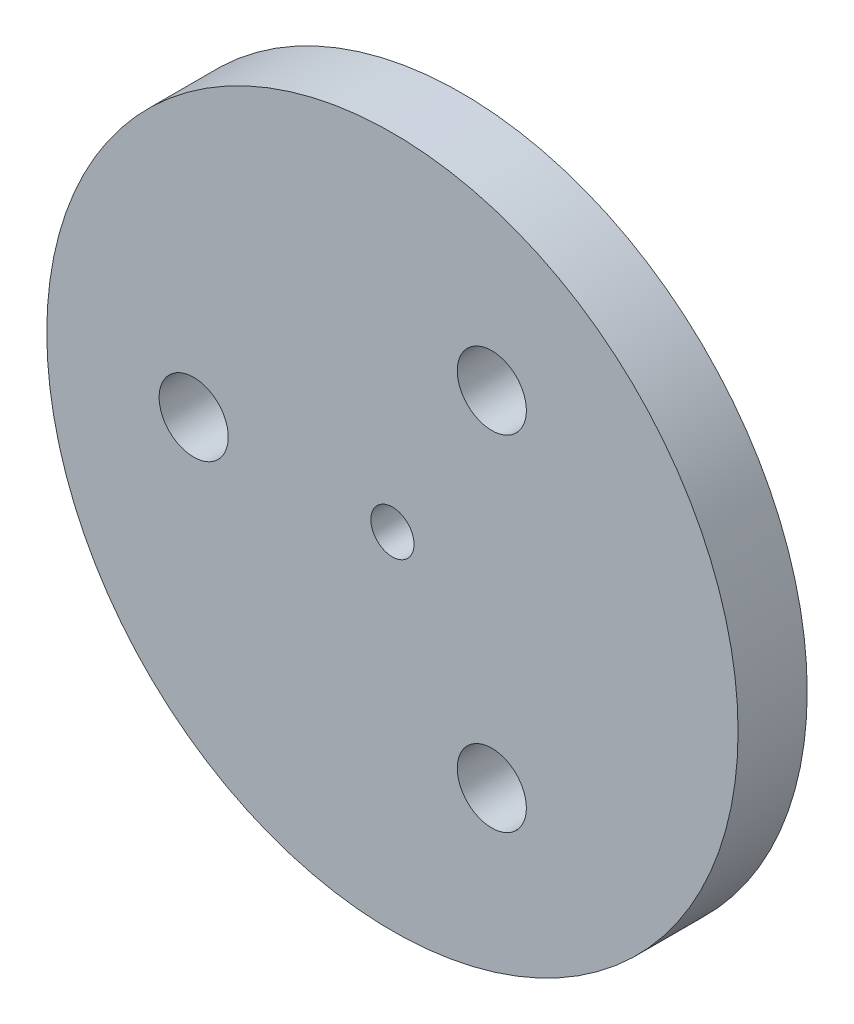
ISO-10303-21;
HEADER;
FILE_DESCRIPTION(('STEP AP214'),'2;1');
FILE_NAME('part.step','',(''),(''),'','','');
FILE_SCHEMA(('AUTOMOTIVE_DESIGN { 1 0 10303 214 1 1 1 1 }'));
ENDSEC;
DATA;
#1=APPLICATION_CONTEXT('core data for automotive mechanical design processes');
#2=APPLICATION_PROTOCOL_DEFINITION('international standard','automotive_design',2000,#1);
#3=PRODUCT_CONTEXT('',#1,'mechanical');
#4=PRODUCT('Part','Part','',(#3));
#5=PRODUCT_RELATED_PRODUCT_CATEGORY('part','',(#4));
#6=PRODUCT_DEFINITION_FORMATION('','',#4);
#7=PRODUCT_DEFINITION_CONTEXT('part definition',#1,'design');
#8=PRODUCT_DEFINITION('design','',#6,#7);
#9=PRODUCT_DEFINITION_SHAPE('','',#8);
#10=(LENGTH_UNIT() NAMED_UNIT(*) SI_UNIT(.MILLI.,.METRE.));
#11=(NAMED_UNIT(*) PLANE_ANGLE_UNIT() SI_UNIT($,.RADIAN.));
#12=(NAMED_UNIT(*) SI_UNIT($,.STERADIAN.) SOLID_ANGLE_UNIT());
#13=UNCERTAINTY_MEASURE_WITH_UNIT(LENGTH_MEASURE(1.E-05),#10,'distance_accuracy_value','');
#14=(GEOMETRIC_REPRESENTATION_CONTEXT(3) GLOBAL_UNCERTAINTY_ASSIGNED_CONTEXT((#13)) GLOBAL_UNIT_ASSIGNED_CONTEXT((#10,
#11,#12)) REPRESENTATION_CONTEXT('',''));
#15=CARTESIAN_POINT('',(0.,0.,0.));
#16=DIRECTION('',(0.,0.,1.));
#17=DIRECTION('',(1.,0.,0.));
#18=AXIS2_PLACEMENT_3D('',#15,#16,#17);
#19=CARTESIAN_POINT('',(0.,0.,4.));
#20=DIRECTION('',(0.,0.,1.));
#21=DIRECTION('',(1.,0.,0.));
#22=AXIS2_PLACEMENT_3D('',#19,#20,#21);
#23=PLANE('',#22);
#24=CARTESIAN_POINT('',(0.,0.,4.));
#25=DIRECTION('',(0.,0.,1.));
#26=DIRECTION('',(1.,0.,0.));
#27=AXIS2_PLACEMENT_3D('',#24,#25,#26);
#28=CIRCLE('',#27,1.25);
#29=CARTESIAN_POINT('',(1.25,0.,4.));
#30=VERTEX_POINT('',#29);
#31=EDGE_CURVE('E79',#30,#30,#28,.T.);
#32=ORIENTED_EDGE('',*,*,#31,.F.);
#33=EDGE_LOOP('',(#32));
#34=FACE_BOUND('',#33,.T.);
#35=CARTESIAN_POINT('',(5.75000000000005,9.95929214352102,4.));
#36=DIRECTION('',(0.,0.,1.));
#37=DIRECTION('',(1.,0.,0.));
#38=AXIS2_PLACEMENT_3D('',#35,#36,#37);
#39=CIRCLE('',#38,2.);
#40=CARTESIAN_POINT('',(7.75000000000005,9.95929214352102,4.));
#41=VERTEX_POINT('',#40);
#42=EDGE_CURVE('E59',#41,#41,#39,.T.);
#43=ORIENTED_EDGE('',*,*,#42,.F.);
#44=EDGE_LOOP('',(#43));
#45=FACE_BOUND('',#44,.T.);
#46=CARTESIAN_POINT('',(0.,0.,4.));
#47=DIRECTION('',(0.,0.,1.));
#48=DIRECTION('',(1.,0.,0.));
#49=AXIS2_PLACEMENT_3D('',#46,#47,#48);
#50=CIRCLE('',#49,20.);
#51=CARTESIAN_POINT('',(20.,0.,4.));
#52=VERTEX_POINT('',#51);
#53=EDGE_CURVE('E10',#52,#52,#50,.T.);
#54=ORIENTED_EDGE('',*,*,#53,.T.);
#55=EDGE_LOOP('',(#54));
#56=FACE_BOUND('',#55,.T.);
#57=CARTESIAN_POINT('',(-11.5,0.,4.));
#58=DIRECTION('',(0.,0.,1.));
#59=DIRECTION('',(1.,0.,0.));
#60=AXIS2_PLACEMENT_3D('',#57,#58,#59);
#61=CIRCLE('',#60,2.);
#62=CARTESIAN_POINT('',(-9.5,0.,4.));
#63=VERTEX_POINT('',#62);
#64=EDGE_CURVE('E53',#63,#63,#61,.T.);
#65=ORIENTED_EDGE('',*,*,#64,.F.);
#66=EDGE_LOOP('',(#65));
#67=FACE_BOUND('',#66,.T.);
#68=CARTESIAN_POINT('',(5.74999999999991,-9.95929214352109,4.));
#69=DIRECTION('',(0.,0.,1.));
#70=DIRECTION('',(1.,0.,0.));
#71=AXIS2_PLACEMENT_3D('',#68,#69,#70);
#72=CIRCLE('',#71,2.);
#73=CARTESIAN_POINT('',(7.7499999999999,-9.95929214352109,4.));
#74=VERTEX_POINT('',#73);
#75=EDGE_CURVE('E67',#74,#74,#72,.T.);
#76=ORIENTED_EDGE('',*,*,#75,.F.);
#77=EDGE_LOOP('',(#76));
#78=FACE_BOUND('',#77,.T.);
#79=ADVANCED_FACE('F40',(#34,#45,#56,#67,#78),#23,.T.);
#80=CARTESIAN_POINT('',(0.,0.,0.));
#81=DIRECTION('',(0.,0.,1.));
#82=DIRECTION('',(1.,0.,0.));
#83=AXIS2_PLACEMENT_3D('',#80,#81,#82);
#84=PLANE('',#83);
#85=CARTESIAN_POINT('',(0.,0.,0.));
#86=DIRECTION('',(0.,0.,1.));
#87=DIRECTION('',(1.,0.,0.));
#88=AXIS2_PLACEMENT_3D('',#85,#86,#87);
#89=CIRCLE('',#88,1.25);
#90=CARTESIAN_POINT('',(1.25,0.,0.));
#91=VERTEX_POINT('',#90);
#92=EDGE_CURVE('E75',#91,#91,#89,.T.);
#93=ORIENTED_EDGE('',*,*,#92,.T.);
#94=EDGE_LOOP('',(#93));
#95=FACE_BOUND('',#94,.T.);
#96=CARTESIAN_POINT('',(0.,0.,0.));
#97=DIRECTION('',(0.,0.,1.));
#98=DIRECTION('',(1.,0.,0.));
#99=AXIS2_PLACEMENT_3D('',#96,#97,#98);
#100=CIRCLE('',#99,20.);
#101=CARTESIAN_POINT('',(20.,0.,0.));
#102=VERTEX_POINT('',#101);
#103=EDGE_CURVE('E44',#102,#102,#100,.T.);
#104=ORIENTED_EDGE('',*,*,#103,.F.);
#105=EDGE_LOOP('',(#104));
#106=FACE_BOUND('',#105,.T.);
#107=CARTESIAN_POINT('',(-11.5,0.,0.));
#108=DIRECTION('',(0.,0.,1.));
#109=DIRECTION('',(1.,0.,0.));
#110=AXIS2_PLACEMENT_3D('',#107,#108,#109);
#111=CIRCLE('',#110,2.);
#112=CARTESIAN_POINT('',(-9.5,0.,0.));
#113=VERTEX_POINT('',#112);
#114=EDGE_CURVE('E55',#113,#113,#111,.T.);
#115=ORIENTED_EDGE('',*,*,#114,.T.);
#116=EDGE_LOOP('',(#115));
#117=FACE_BOUND('',#116,.T.);
#118=CARTESIAN_POINT('',(5.75000000000005,9.95929214352102,0.));
#119=DIRECTION('',(0.,0.,1.));
#120=DIRECTION('',(1.,0.,0.));
#121=AXIS2_PLACEMENT_3D('',#118,#119,#120);
#122=CIRCLE('',#121,2.);
#123=CARTESIAN_POINT('',(7.75000000000005,9.95929214352102,0.));
#124=VERTEX_POINT('',#123);
#125=EDGE_CURVE('E63',#124,#124,#122,.T.);
#126=ORIENTED_EDGE('',*,*,#125,.T.);
#127=EDGE_LOOP('',(#126));
#128=FACE_BOUND('',#127,.T.);
#129=CARTESIAN_POINT('',(5.74999999999991,-9.95929214352109,0.));
#130=DIRECTION('',(0.,0.,1.));
#131=DIRECTION('',(1.,0.,0.));
#132=AXIS2_PLACEMENT_3D('',#129,#130,#131);
#133=CIRCLE('',#132,2.);
#134=CARTESIAN_POINT('',(7.7499999999999,-9.95929214352109,0.));
#135=VERTEX_POINT('',#134);
#136=EDGE_CURVE('E71',#135,#135,#133,.T.);
#137=ORIENTED_EDGE('',*,*,#136,.T.);
#138=EDGE_LOOP('',(#137));
#139=FACE_BOUND('',#138,.T.);
#140=ADVANCED_FACE('F87',(#95,#106,#117,#128,#139),#84,.F.);
#141=CARTESIAN_POINT('',(0.,0.,4.));
#142=DIRECTION('',(0.,0.,-1.));
#143=DIRECTION('',(-1.,0.,0.));
#144=AXIS2_PLACEMENT_3D('',#141,#142,#143);
#145=CYLINDRICAL_SURFACE('',#144,20.);
#146=ORIENTED_EDGE('',*,*,#53,.F.);
#147=EDGE_LOOP('',(#146));
#148=FACE_BOUND('',#147,.T.);
#149=ORIENTED_EDGE('',*,*,#103,.T.);
#150=EDGE_LOOP('',(#149));
#151=FACE_BOUND('',#150,.T.);
#152=ADVANCED_FACE('F42',(#148,#151),#145,.T.);
#153=CARTESIAN_POINT('',(-11.5,0.,4.));
#154=DIRECTION('',(0.,0.,-1.));
#155=DIRECTION('',(-1.,0.,0.));
#156=AXIS2_PLACEMENT_3D('',#153,#154,#155);
#157=CYLINDRICAL_SURFACE('',#156,2.);
#158=ORIENTED_EDGE('',*,*,#64,.T.);
#159=EDGE_LOOP('',(#158));
#160=FACE_BOUND('',#159,.T.);
#161=ORIENTED_EDGE('',*,*,#114,.F.);
#162=EDGE_LOOP('',(#161));
#163=FACE_BOUND('',#162,.T.);
#164=ADVANCED_FACE('F117',(#160,#163),#157,.F.);
#165=CARTESIAN_POINT('',(5.75000000000005,9.95929214352102,4.));
#166=DIRECTION('',(0.,0.,-1.));
#167=DIRECTION('',(-1.,0.,0.));
#168=AXIS2_PLACEMENT_3D('',#165,#166,#167);
#169=CYLINDRICAL_SURFACE('',#168,2.);
#170=ORIENTED_EDGE('',*,*,#42,.T.);
#171=EDGE_LOOP('',(#170));
#172=FACE_BOUND('',#171,.T.);
#173=ORIENTED_EDGE('',*,*,#125,.F.);
#174=EDGE_LOOP('',(#173));
#175=FACE_BOUND('',#174,.T.);
#176=ADVANCED_FACE('F108',(#172,#175),#169,.F.);
#177=CARTESIAN_POINT('',(5.74999999999991,-9.95929214352109,4.));
#178=DIRECTION('',(0.,0.,-1.));
#179=DIRECTION('',(-1.,0.,0.));
#180=AXIS2_PLACEMENT_3D('',#177,#178,#179);
#181=CYLINDRICAL_SURFACE('',#180,2.);
#182=ORIENTED_EDGE('',*,*,#75,.T.);
#183=EDGE_LOOP('',(#182));
#184=FACE_BOUND('',#183,.T.);
#185=ORIENTED_EDGE('',*,*,#136,.F.);
#186=EDGE_LOOP('',(#185));
#187=FACE_BOUND('',#186,.T.);
#188=ADVANCED_FACE('F93',(#184,#187),#181,.F.);
#189=CARTESIAN_POINT('',(0.,0.,0.));
#190=DIRECTION('',(0.,0.,1.));
#191=DIRECTION('',(1.,0.,0.));
#192=AXIS2_PLACEMENT_3D('',#189,#190,#191);
#193=CYLINDRICAL_SURFACE('',#192,1.25);
#194=ORIENTED_EDGE('',*,*,#92,.F.);
#195=EDGE_LOOP('',(#194));
#196=FACE_BOUND('',#195,.T.);
#197=ORIENTED_EDGE('',*,*,#31,.T.);
#198=EDGE_LOOP('',(#197));
#199=FACE_BOUND('',#198,.T.);
#200=ADVANCED_FACE('F90',(#196,#199),#193,.F.);
#201=CLOSED_SHELL('',(#79,#140,#152,#164,#176,#188,#200));
#202=MANIFOLD_SOLID_BREP('B2',#201);
#203=ADVANCED_BREP_SHAPE_REPRESENTATION('',(#18,#202),#14);
#204=SHAPE_DEFINITION_REPRESENTATION(#9,#203);
ENDSEC;
END-ISO-10303-21;
